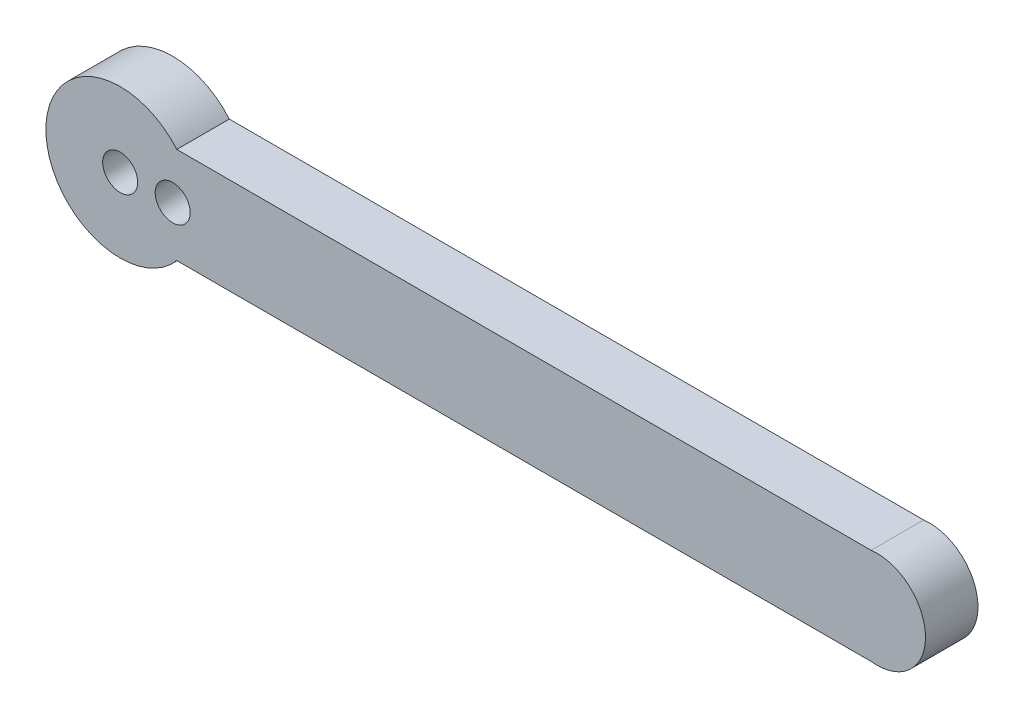
ISO-10303-21;
HEADER;
FILE_DESCRIPTION(('STEP AP214'),'2;1');
FILE_NAME('part.step','',(''),(''),'','','');
FILE_SCHEMA(('AUTOMOTIVE_DESIGN { 1 0 10303 214 1 1 1 1 }'));
ENDSEC;
DATA;
#1=APPLICATION_CONTEXT('core data for automotive mechanical design processes');
#2=APPLICATION_PROTOCOL_DEFINITION('international standard','automotive_design',2000,#1);
#3=PRODUCT_CONTEXT('',#1,'mechanical');
#4=PRODUCT('Part','Part','',(#3));
#5=PRODUCT_RELATED_PRODUCT_CATEGORY('part','',(#4));
#6=PRODUCT_DEFINITION_FORMATION('','',#4);
#7=PRODUCT_DEFINITION_CONTEXT('part definition',#1,'design');
#8=PRODUCT_DEFINITION('design','',#6,#7);
#9=PRODUCT_DEFINITION_SHAPE('','',#8);
#10=(LENGTH_UNIT() NAMED_UNIT(*) SI_UNIT(.MILLI.,.METRE.));
#11=(NAMED_UNIT(*) PLANE_ANGLE_UNIT() SI_UNIT($,.RADIAN.));
#12=(NAMED_UNIT(*) SI_UNIT($,.STERADIAN.) SOLID_ANGLE_UNIT());
#13=UNCERTAINTY_MEASURE_WITH_UNIT(LENGTH_MEASURE(1.E-05),#10,'distance_accuracy_value','');
#14=(GEOMETRIC_REPRESENTATION_CONTEXT(3) GLOBAL_UNCERTAINTY_ASSIGNED_CONTEXT((#13)) GLOBAL_UNIT_ASSIGNED_CONTEXT((#10,
#11,#12)) REPRESENTATION_CONTEXT('',''));
#15=CARTESIAN_POINT('',(0.,0.,0.));
#16=DIRECTION('',(0.,0.,1.));
#17=DIRECTION('',(1.,0.,0.));
#18=AXIS2_PLACEMENT_3D('',#15,#16,#17);
#19=CARTESIAN_POINT('',(43.2346059682655,0.,3.));
#20=DIRECTION('',(0.,0.,-1.));
#21=DIRECTION('',(-1.,0.,0.));
#22=AXIS2_PLACEMENT_3D('',#19,#20,#21);
#23=CYLINDRICAL_SURFACE('',#22,2.77063377037215);
#24=CARTESIAN_POINT('',(43.2346059682655,0.,0.));
#25=DIRECTION('',(0.,0.,1.));
#26=DIRECTION('',(1.,0.,0.));
#27=AXIS2_PLACEMENT_3D('',#24,#25,#26);
#28=CIRCLE('',#27,2.77063377037215);
#29=CARTESIAN_POINT('',(42.8970982060931,-2.75,0.));
#30=VERTEX_POINT('',#29);
#31=CARTESIAN_POINT('',(42.8970982060931,2.75,0.));
#32=VERTEX_POINT('',#31);
#33=EDGE_CURVE('E105',#30,#32,#28,.T.);
#34=ORIENTED_EDGE('',*,*,#33,.T.);
#35=DIRECTION('',(0.,0.,-1.));
#36=VECTOR('',#35,1.);
#37=CARTESIAN_POINT('',(42.8970982060931,2.75,3.));
#38=LINE('',#37,#36);
#39=CARTESIAN_POINT('',(42.8970982060931,2.75,3.));
#40=VERTEX_POINT('',#39);
#41=EDGE_CURVE('E60',#40,#32,#38,.T.);
#42=ORIENTED_EDGE('',*,*,#41,.F.);
#43=CARTESIAN_POINT('',(43.2346059682655,0.,3.));
#44=DIRECTION('',(0.,0.,1.));
#45=DIRECTION('',(1.,0.,0.));
#46=AXIS2_PLACEMENT_3D('',#43,#44,#45);
#47=CIRCLE('',#46,2.77063377037215);
#48=CARTESIAN_POINT('',(42.8970982060931,-2.75,3.));
#49=VERTEX_POINT('',#48);
#50=EDGE_CURVE('E94',#49,#40,#47,.T.);
#51=ORIENTED_EDGE('',*,*,#50,.F.);
#52=DIRECTION('',(0.,0.,-1.));
#53=VECTOR('',#52,1.);
#54=CARTESIAN_POINT('',(42.8970982060931,-2.75,3.));
#55=LINE('',#54,#53);
#56=EDGE_CURVE('E12',#49,#30,#55,.T.);
#57=ORIENTED_EDGE('',*,*,#56,.T.);
#58=EDGE_LOOP('',(#34,#42,#51,#57));
#59=FACE_BOUND('',#58,.T.);
#60=ADVANCED_FACE('F50',(#59),#23,.T.);
#61=CARTESIAN_POINT('',(0.,2.75,3.));
#62=DIRECTION('',(0.,1.,0.));
#63=DIRECTION('',(0.,0.,1.));
#64=AXIS2_PLACEMENT_3D('',#61,#62,#63);
#65=PLANE('',#64);
#66=DIRECTION('',(1.,0.,0.));
#67=VECTOR('',#66,1.);
#68=CARTESIAN_POINT('',(0.,2.75,0.));
#69=LINE('',#68,#67);
#70=CARTESIAN_POINT('',(3.23460596826545,2.75,0.));
#71=VERTEX_POINT('',#70);
#72=EDGE_CURVE('E119',#71,#32,#69,.T.);
#73=ORIENTED_EDGE('',*,*,#72,.F.);
#74=DIRECTION('',(0.,0.,-1.));
#75=VECTOR('',#74,1.);
#76=CARTESIAN_POINT('',(3.23460596826545,2.75,3.));
#77=LINE('',#76,#75);
#78=CARTESIAN_POINT('',(3.23460596826545,2.75,3.));
#79=VERTEX_POINT('',#78);
#80=EDGE_CURVE('E83',#79,#71,#77,.T.);
#81=ORIENTED_EDGE('',*,*,#80,.F.);
#82=DIRECTION('',(1.,0.,0.));
#83=VECTOR('',#82,1.);
#84=CARTESIAN_POINT('',(0.,2.75,3.));
#85=LINE('',#84,#83);
#86=EDGE_CURVE('E100',#79,#40,#85,.T.);
#87=ORIENTED_EDGE('',*,*,#86,.T.);
#88=ORIENTED_EDGE('',*,*,#41,.T.);
#89=EDGE_LOOP('',(#73,#81,#87,#88));
#90=FACE_BOUND('',#89,.T.);
#91=ADVANCED_FACE('F110',(#90),#65,.T.);
#92=CARTESIAN_POINT('',(0.,-2.75,3.));
#93=DIRECTION('',(0.,1.,0.));
#94=DIRECTION('',(0.,0.,1.));
#95=AXIS2_PLACEMENT_3D('',#92,#93,#94);
#96=PLANE('',#95);
#97=DIRECTION('',(1.,0.,0.));
#98=VECTOR('',#97,1.);
#99=CARTESIAN_POINT('',(0.,-2.75,0.));
#100=LINE('',#99,#98);
#101=CARTESIAN_POINT('',(3.23460596826545,-2.75,0.));
#102=VERTEX_POINT('',#101);
#103=EDGE_CURVE('E115',#102,#30,#100,.T.);
#104=ORIENTED_EDGE('',*,*,#103,.T.);
#105=ORIENTED_EDGE('',*,*,#56,.F.);
#106=DIRECTION('',(1.,0.,0.));
#107=VECTOR('',#106,1.);
#108=CARTESIAN_POINT('',(0.,-2.75,3.));
#109=LINE('',#108,#107);
#110=CARTESIAN_POINT('',(3.23460596826545,-2.75,3.));
#111=VERTEX_POINT('',#110);
#112=EDGE_CURVE('E101',#111,#49,#109,.T.);
#113=ORIENTED_EDGE('',*,*,#112,.F.);
#114=DIRECTION('',(0.,0.,-1.));
#115=VECTOR('',#114,1.);
#116=CARTESIAN_POINT('',(3.23460596826545,-2.75,3.));
#117=LINE('',#116,#115);
#118=EDGE_CURVE('E69',#111,#102,#117,.T.);
#119=ORIENTED_EDGE('',*,*,#118,.T.);
#120=EDGE_LOOP('',(#104,#105,#113,#119));
#121=FACE_BOUND('',#120,.T.);
#122=ADVANCED_FACE('F155',(#121),#96,.F.);
#123=CARTESIAN_POINT('',(0.,0.,0.));
#124=DIRECTION('',(0.,0.,1.));
#125=DIRECTION('',(1.,0.,0.));
#126=AXIS2_PLACEMENT_3D('',#123,#124,#125);
#127=PLANE('',#126);
#128=CARTESIAN_POINT('',(0.,0.,0.));
#129=DIRECTION('',(0.,0.,1.));
#130=DIRECTION('',(1.,0.,0.));
#131=AXIS2_PLACEMENT_3D('',#128,#129,#130);
#132=CIRCLE('',#131,1.);
#133=CARTESIAN_POINT('',(1.,0.,0.));
#134=VERTEX_POINT('',#133);
#135=EDGE_CURVE('E121',#134,#134,#132,.T.);
#136=ORIENTED_EDGE('',*,*,#135,.T.);
#137=EDGE_LOOP('',(#136));
#138=FACE_BOUND('',#137,.T.);
#139=CARTESIAN_POINT('',(3.,0.,0.));
#140=DIRECTION('',(0.,0.,1.));
#141=DIRECTION('',(1.,0.,0.));
#142=AXIS2_PLACEMENT_3D('',#139,#140,#141);
#143=CIRCLE('',#142,1.);
#144=CARTESIAN_POINT('',(4.,0.,0.));
#145=VERTEX_POINT('',#144);
#146=EDGE_CURVE('E124',#145,#145,#143,.T.);
#147=ORIENTED_EDGE('',*,*,#146,.T.);
#148=EDGE_LOOP('',(#147));
#149=FACE_BOUND('',#148,.T.);
#150=ORIENTED_EDGE('',*,*,#103,.F.);
#151=CARTESIAN_POINT('',(0.,0.,0.));
#152=DIRECTION('',(0.,0.,1.));
#153=DIRECTION('',(1.,0.,0.));
#154=AXIS2_PLACEMENT_3D('',#151,#152,#153);
#155=CIRCLE('',#154,4.24560664333597);
#156=EDGE_CURVE('E54',#71,#102,#155,.T.);
#157=ORIENTED_EDGE('',*,*,#156,.F.);
#158=ORIENTED_EDGE('',*,*,#72,.T.);
#159=ORIENTED_EDGE('',*,*,#33,.F.);
#160=EDGE_LOOP('',(#150,#157,#158,#159));
#161=FACE_BOUND('',#160,.T.);
#162=ADVANCED_FACE('F143',(#138,#149,#161),#127,.F.);
#163=CARTESIAN_POINT('',(0.,0.,3.));
#164=DIRECTION('',(0.,0.,1.));
#165=DIRECTION('',(1.,0.,0.));
#166=AXIS2_PLACEMENT_3D('',#163,#164,#165);
#167=PLANE('',#166);
#168=CARTESIAN_POINT('',(0.,0.,3.));
#169=DIRECTION('',(0.,0.,1.));
#170=DIRECTION('',(1.,0.,0.));
#171=AXIS2_PLACEMENT_3D('',#168,#169,#170);
#172=CIRCLE('',#171,1.);
#173=CARTESIAN_POINT('',(1.,0.,3.));
#174=VERTEX_POINT('',#173);
#175=EDGE_CURVE('E129',#174,#174,#172,.T.);
#176=ORIENTED_EDGE('',*,*,#175,.F.);
#177=EDGE_LOOP('',(#176));
#178=FACE_BOUND('',#177,.T.);
#179=CARTESIAN_POINT('',(3.,0.,3.));
#180=DIRECTION('',(0.,0.,1.));
#181=DIRECTION('',(1.,0.,0.));
#182=AXIS2_PLACEMENT_3D('',#179,#180,#181);
#183=CIRCLE('',#182,1.);
#184=CARTESIAN_POINT('',(4.,0.,3.));
#185=VERTEX_POINT('',#184);
#186=EDGE_CURVE('E132',#185,#185,#183,.T.);
#187=ORIENTED_EDGE('',*,*,#186,.F.);
#188=EDGE_LOOP('',(#187));
#189=FACE_BOUND('',#188,.T.);
#190=ORIENTED_EDGE('',*,*,#112,.T.);
#191=ORIENTED_EDGE('',*,*,#50,.T.);
#192=ORIENTED_EDGE('',*,*,#86,.F.);
#193=CARTESIAN_POINT('',(0.,0.,3.));
#194=DIRECTION('',(0.,0.,1.));
#195=DIRECTION('',(1.,0.,0.));
#196=AXIS2_PLACEMENT_3D('',#193,#194,#195);
#197=CIRCLE('',#196,4.24560664333597);
#198=EDGE_CURVE('E117',#79,#111,#197,.T.);
#199=ORIENTED_EDGE('',*,*,#198,.T.);
#200=EDGE_LOOP('',(#190,#191,#192,#199));
#201=FACE_BOUND('',#200,.T.);
#202=ADVANCED_FACE('F98',(#178,#189,#201),#167,.T.);
#203=CARTESIAN_POINT('',(0.,0.,3.));
#204=DIRECTION('',(0.,0.,-1.));
#205=DIRECTION('',(-1.,0.,0.));
#206=AXIS2_PLACEMENT_3D('',#203,#204,#205);
#207=CYLINDRICAL_SURFACE('',#206,4.24560664333597);
#208=ORIENTED_EDGE('',*,*,#156,.T.);
#209=ORIENTED_EDGE('',*,*,#118,.F.);
#210=ORIENTED_EDGE('',*,*,#198,.F.);
#211=ORIENTED_EDGE('',*,*,#80,.T.);
#212=EDGE_LOOP('',(#208,#209,#210,#211));
#213=FACE_BOUND('',#212,.T.);
#214=ADVANCED_FACE('F52',(#213),#207,.T.);
#215=CARTESIAN_POINT('',(3.,0.,-7.));
#216=DIRECTION('',(0.,0.,1.));
#217=DIRECTION('',(1.,0.,0.));
#218=AXIS2_PLACEMENT_3D('',#215,#216,#217);
#219=CYLINDRICAL_SURFACE('',#218,1.);
#220=ORIENTED_EDGE('',*,*,#186,.T.);
#221=EDGE_LOOP('',(#220));
#222=FACE_BOUND('',#221,.T.);
#223=ORIENTED_EDGE('',*,*,#146,.F.);
#224=EDGE_LOOP('',(#223));
#225=FACE_BOUND('',#224,.T.);
#226=ADVANCED_FACE('F147',(#222,#225),#219,.F.);
#227=CARTESIAN_POINT('',(0.,0.,-7.));
#228=DIRECTION('',(0.,0.,1.));
#229=DIRECTION('',(1.,0.,0.));
#230=AXIS2_PLACEMENT_3D('',#227,#228,#229);
#231=CYLINDRICAL_SURFACE('',#230,1.);
#232=ORIENTED_EDGE('',*,*,#175,.T.);
#233=EDGE_LOOP('',(#232));
#234=FACE_BOUND('',#233,.T.);
#235=ORIENTED_EDGE('',*,*,#135,.F.);
#236=EDGE_LOOP('',(#235));
#237=FACE_BOUND('',#236,.T.);
#238=ADVANCED_FACE('F138',(#234,#237),#231,.F.);
#239=CLOSED_SHELL('',(#60,#91,#122,#162,#202,#214,#226,#238));
#240=MANIFOLD_SOLID_BREP('B2',#239);
#241=ADVANCED_BREP_SHAPE_REPRESENTATION('',(#18,#240),#14);
#242=SHAPE_DEFINITION_REPRESENTATION(#9,#241);
ENDSEC;
END-ISO-10303-21;
